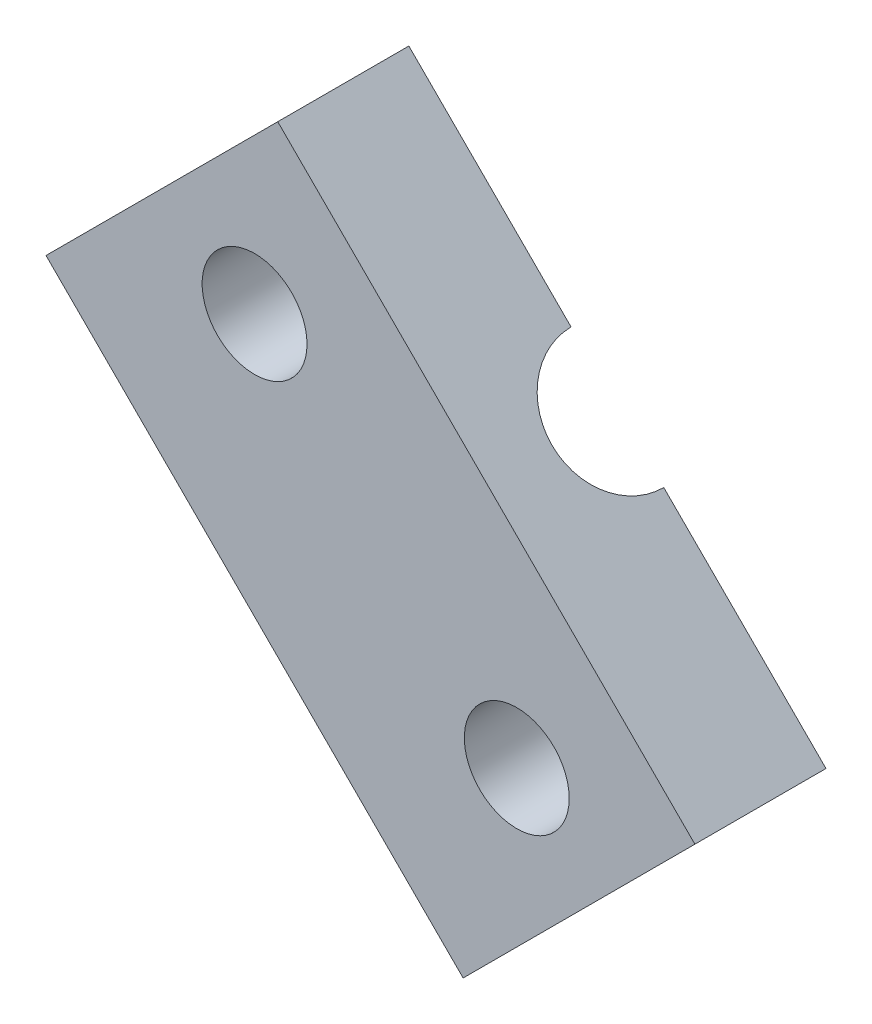
ISO-10303-21;
HEADER;
FILE_DESCRIPTION(('STEP AP214'),'2;1');
FILE_NAME('part.step','',(''),(''),'','','');
FILE_SCHEMA(('AUTOMOTIVE_DESIGN { 1 0 10303 214 1 1 1 1 }'));
ENDSEC;
DATA;
#1=APPLICATION_CONTEXT('core data for automotive mechanical design processes');
#2=APPLICATION_PROTOCOL_DEFINITION('international standard','automotive_design',2000,#1);
#3=PRODUCT_CONTEXT('',#1,'mechanical');
#4=PRODUCT('Part','Part','',(#3));
#5=PRODUCT_RELATED_PRODUCT_CATEGORY('part','',(#4));
#6=PRODUCT_DEFINITION_FORMATION('','',#4);
#7=PRODUCT_DEFINITION_CONTEXT('part definition',#1,'design');
#8=PRODUCT_DEFINITION('design','',#6,#7);
#9=PRODUCT_DEFINITION_SHAPE('','',#8);
#10=(LENGTH_UNIT() NAMED_UNIT(*) SI_UNIT(.MILLI.,.METRE.));
#11=(NAMED_UNIT(*) PLANE_ANGLE_UNIT() SI_UNIT($,.RADIAN.));
#12=(NAMED_UNIT(*) SI_UNIT($,.STERADIAN.) SOLID_ANGLE_UNIT());
#13=UNCERTAINTY_MEASURE_WITH_UNIT(LENGTH_MEASURE(1.E-05),#10,'distance_accuracy_value','');
#14=(GEOMETRIC_REPRESENTATION_CONTEXT(3) GLOBAL_UNCERTAINTY_ASSIGNED_CONTEXT((#13)) GLOBAL_UNIT_ASSIGNED_CONTEXT((#10,
#11,#12)) REPRESENTATION_CONTEXT('',''));
#15=CARTESIAN_POINT('',(0.,0.,0.));
#16=DIRECTION('',(0.,0.,1.));
#17=DIRECTION('',(1.,0.,0.));
#18=AXIS2_PLACEMENT_3D('',#15,#16,#17);
#19=CARTESIAN_POINT('',(7.07106781186549,7.07106781186546,0.));
#20=DIRECTION('',(-0.707106781186549,-0.707106781186546,0.));
#21=DIRECTION('',(0.707106781186546,-0.707106781186549,0.));
#22=AXIS2_PLACEMENT_3D('',#19,#20,#21);
#23=CYLINDRICAL_SURFACE('',#22,2.00000000000002);
#24=CARTESIAN_POINT('',(0.,0.,0.));
#25=DIRECTION('',(0.707106781186549,0.707106781186546,0.));
#26=DIRECTION('',(-0.707106781186546,0.707106781186549,0.));
#27=AXIS2_PLACEMENT_3D('',#24,#25,#26);
#28=CIRCLE('',#27,2.00000000000002);
#29=CARTESIAN_POINT('',(-1.41421356237311,1.41421356237311,0.));
#30=VERTEX_POINT('',#29);
#31=CARTESIAN_POINT('',(1.41421356237311,-1.41421356237311,0.));
#32=VERTEX_POINT('',#31);
#33=EDGE_CURVE('E129',#30,#32,#28,.T.);
#34=ORIENTED_EDGE('',*,*,#33,.F.);
#35=DIRECTION('',(-0.707106781186549,-0.707106781186546,0.));
#36=VECTOR('',#35,1.);
#37=CARTESIAN_POINT('',(5.65685424949238,8.48528137423858,0.));
#38=LINE('',#37,#36);
#39=CARTESIAN_POINT('',(5.65685424949238,8.48528137423858,0.));
#40=VERTEX_POINT('',#39);
#41=EDGE_CURVE('E11',#40,#30,#38,.T.);
#42=ORIENTED_EDGE('',*,*,#41,.F.);
#43=CARTESIAN_POINT('',(7.07106781186549,7.07106781186546,0.));
#44=DIRECTION('',(0.707106781186549,0.707106781186546,0.));
#45=DIRECTION('',(-0.707106781186546,0.707106781186549,0.));
#46=AXIS2_PLACEMENT_3D('',#43,#44,#45);
#47=CIRCLE('',#46,2.00000000000002);
#48=CARTESIAN_POINT('',(8.4852813742386,5.65685424949235,0.));
#49=VERTEX_POINT('',#48);
#50=EDGE_CURVE('E155',#40,#49,#47,.T.);
#51=ORIENTED_EDGE('',*,*,#50,.T.);
#52=DIRECTION('',(-0.707106781186549,-0.707106781186546,0.));
#53=VECTOR('',#52,1.);
#54=CARTESIAN_POINT('',(8.4852813742386,5.65685424949235,0.));
#55=LINE('',#54,#53);
#56=EDGE_CURVE('E62',#49,#32,#55,.T.);
#57=ORIENTED_EDGE('',*,*,#56,.T.);
#58=EDGE_LOOP('',(#34,#42,#51,#57));
#59=FACE_BOUND('',#58,.T.);
#60=ADVANCED_FACE('F45',(#59),#23,.F.);
#61=CARTESIAN_POINT('',(7.07106781186549,7.07106781186546,0.));
#62=DIRECTION('',(0.,0.,-1.));
#63=DIRECTION('',(0.,1.,0.));
#64=AXIS2_PLACEMENT_3D('',#61,#62,#63);
#65=PLANE('',#64);
#66=CARTESIAN_POINT('',(0.,8.00000000000004,0.));
#67=DIRECTION('',(0.,0.,-1.));
#68=DIRECTION('',(0.,1.,0.));
#69=AXIS2_PLACEMENT_3D('',#66,#67,#68);
#70=CIRCLE('',#69,1.6);
#71=CARTESIAN_POINT('',(0.,9.60000000000004,0.));
#72=VERTEX_POINT('',#71);
#73=EDGE_CURVE('E132',#72,#72,#70,.T.);
#74=ORIENTED_EDGE('',*,*,#73,.F.);
#75=EDGE_LOOP('',(#74));
#76=FACE_BOUND('',#75,.T.);
#77=DIRECTION('',(0.707106781186546,-0.707106781186549,0.));
#78=VECTOR('',#77,1.);
#79=CARTESIAN_POINT('',(0.,0.,0.));
#80=LINE('',#79,#78);
#81=CARTESIAN_POINT('',(-6.36396103067891,6.36396103067892,0.));
#82=VERTEX_POINT('',#81);
#83=EDGE_CURVE('E131',#82,#30,#80,.T.);
#84=ORIENTED_EDGE('',*,*,#83,.F.);
#85=DIRECTION('',(-0.707106781186549,-0.707106781186546,0.));
#86=VECTOR('',#85,1.);
#87=CARTESIAN_POINT('',(0.707106781186583,13.4350288425444,0.));
#88=LINE('',#87,#86);
#89=CARTESIAN_POINT('',(0.707106781186583,13.4350288425444,0.));
#90=VERTEX_POINT('',#89);
#91=EDGE_CURVE('E54',#90,#82,#88,.T.);
#92=ORIENTED_EDGE('',*,*,#91,.F.);
#93=DIRECTION('',(0.707106781186546,-0.707106781186549,0.));
#94=VECTOR('',#93,1.);
#95=CARTESIAN_POINT('',(7.07106781186549,7.07106781186546,0.));
#96=LINE('',#95,#94);
#97=EDGE_CURVE('E126',#90,#40,#96,.T.);
#98=ORIENTED_EDGE('',*,*,#97,.T.);
#99=ORIENTED_EDGE('',*,*,#41,.T.);
#100=EDGE_LOOP('',(#84,#92,#98,#99));
#101=FACE_BOUND('',#100,.T.);
#102=ADVANCED_FACE('F152',(#76,#101),#65,.T.);
#103=CARTESIAN_POINT('',(0.707106781186583,13.4350288425444,0.));
#104=DIRECTION('',(0.707106781186546,-0.707106781186549,0.));
#105=DIRECTION('',(0.707106781186549,0.707106781186546,0.));
#106=AXIS2_PLACEMENT_3D('',#103,#104,#105);
#107=PLANE('',#106);
#108=DIRECTION('',(0.,0.,1.));
#109=VECTOR('',#108,1.);
#110=CARTESIAN_POINT('',(-6.36396103067891,6.36396103067892,0.));
#111=LINE('',#110,#109);
#112=CARTESIAN_POINT('',(-6.3639610306789,6.36396103067892,4.00000000000001));
#113=VERTEX_POINT('',#112);
#114=EDGE_CURVE('E135',#82,#113,#111,.T.);
#115=ORIENTED_EDGE('',*,*,#114,.T.);
#116=DIRECTION('',(-0.707106781186549,-0.707106781186546,0.));
#117=VECTOR('',#116,1.);
#118=CARTESIAN_POINT('',(0.707106781186584,13.4350288425444,4.00000000000001));
#119=LINE('',#118,#117);
#120=CARTESIAN_POINT('',(0.707106781186584,13.4350288425444,4.00000000000001));
#121=VERTEX_POINT('',#120);
#122=EDGE_CURVE('E120',#121,#113,#119,.T.);
#123=ORIENTED_EDGE('',*,*,#122,.F.);
#124=DIRECTION('',(0.,0.,1.));
#125=VECTOR('',#124,1.);
#126=CARTESIAN_POINT('',(0.707106781186583,13.4350288425444,0.));
#127=LINE('',#126,#125);
#128=EDGE_CURVE('E108',#90,#121,#127,.T.);
#129=ORIENTED_EDGE('',*,*,#128,.F.);
#130=ORIENTED_EDGE('',*,*,#91,.T.);
#131=EDGE_LOOP('',(#115,#123,#129,#130));
#132=FACE_BOUND('',#131,.T.);
#133=ADVANCED_FACE('F146',(#132),#107,.F.);
#134=CARTESIAN_POINT('',(7.07106781186549,7.07106781186546,4.00000000000001));
#135=DIRECTION('',(0.,0.,-1.));
#136=DIRECTION('',(0.,1.,0.));
#137=AXIS2_PLACEMENT_3D('',#134,#135,#136);
#138=PLANE('',#137);
#139=CARTESIAN_POINT('',(0.,8.00000000000004,4.00000000000001));
#140=DIRECTION('',(0.,0.,1.));
#141=DIRECTION('',(1.,0.,0.));
#142=AXIS2_PLACEMENT_3D('',#139,#140,#141);
#143=CIRCLE('',#142,1.6);
#144=CARTESIAN_POINT('',(1.60000000000007,8.00000000000004,4.00000000000001));
#145=VERTEX_POINT('',#144);
#146=EDGE_CURVE('E163',#145,#145,#143,.T.);
#147=ORIENTED_EDGE('',*,*,#146,.F.);
#148=EDGE_LOOP('',(#147));
#149=FACE_BOUND('',#148,.T.);
#150=CARTESIAN_POINT('',(8.00000000000002,0.,4.00000000000001));
#151=DIRECTION('',(0.,0.,1.));
#152=DIRECTION('',(1.,0.,0.));
#153=AXIS2_PLACEMENT_3D('',#150,#151,#152);
#154=CIRCLE('',#153,1.6);
#155=CARTESIAN_POINT('',(9.60000000000002,0.,4.00000000000001));
#156=VERTEX_POINT('',#155);
#157=EDGE_CURVE('E160',#156,#156,#154,.T.);
#158=ORIENTED_EDGE('',*,*,#157,.F.);
#159=EDGE_LOOP('',(#158));
#160=FACE_BOUND('',#159,.T.);
#161=DIRECTION('',(0.707106781186546,-0.707106781186549,0.));
#162=VECTOR('',#161,1.);
#163=CARTESIAN_POINT('',(0.,0.,4.00000000000001));
#164=LINE('',#163,#162);
#165=CARTESIAN_POINT('',(6.36396103067894,-6.36396103067896,4.));
#166=VERTEX_POINT('',#165);
#167=EDGE_CURVE('E117',#113,#166,#164,.T.);
#168=ORIENTED_EDGE('',*,*,#167,.T.);
#169=DIRECTION('',(-0.707106781186549,-0.707106781186546,0.));
#170=VECTOR('',#169,1.);
#171=CARTESIAN_POINT('',(13.4350288425444,0.707106781186508,4.));
#172=LINE('',#171,#170);
#173=CARTESIAN_POINT('',(13.4350288425444,0.707106781186508,4.));
#174=VERTEX_POINT('',#173);
#175=EDGE_CURVE('E114',#174,#166,#172,.T.);
#176=ORIENTED_EDGE('',*,*,#175,.F.);
#177=DIRECTION('',(0.707106781186546,-0.707106781186549,0.));
#178=VECTOR('',#177,1.);
#179=CARTESIAN_POINT('',(7.07106781186549,7.07106781186546,4.00000000000001));
#180=LINE('',#179,#178);
#181=EDGE_CURVE('E100',#121,#174,#180,.T.);
#182=ORIENTED_EDGE('',*,*,#181,.F.);
#183=ORIENTED_EDGE('',*,*,#122,.T.);
#184=EDGE_LOOP('',(#168,#176,#182,#183));
#185=FACE_BOUND('',#184,.T.);
#186=ADVANCED_FACE('F115',(#149,#160,#185),#138,.F.);
#187=CARTESIAN_POINT('',(13.4350288425444,0.707106781186505,0.));
#188=DIRECTION('',(0.707106781186546,-0.707106781186549,0.));
#189=DIRECTION('',(0.707106781186549,0.707106781186546,0.));
#190=AXIS2_PLACEMENT_3D('',#187,#188,#189);
#191=PLANE('',#190);
#192=DIRECTION('',(0.,0.,1.));
#193=VECTOR('',#192,1.);
#194=CARTESIAN_POINT('',(6.36396103067894,-6.36396103067896,0.));
#195=LINE('',#194,#193);
#196=CARTESIAN_POINT('',(6.36396103067894,-6.36396103067896,0.));
#197=VERTEX_POINT('',#196);
#198=EDGE_CURVE('E139',#197,#166,#195,.T.);
#199=ORIENTED_EDGE('',*,*,#198,.F.);
#200=DIRECTION('',(-0.707106781186549,-0.707106781186546,0.));
#201=VECTOR('',#200,1.);
#202=CARTESIAN_POINT('',(13.4350288425444,0.707106781186507,0.));
#203=LINE('',#202,#201);
#204=CARTESIAN_POINT('',(13.4350288425444,0.707106781186507,0.));
#205=VERTEX_POINT('',#204);
#206=EDGE_CURVE('E81',#205,#197,#203,.T.);
#207=ORIENTED_EDGE('',*,*,#206,.F.);
#208=DIRECTION('',(0.,0.,1.));
#209=VECTOR('',#208,1.);
#210=CARTESIAN_POINT('',(13.4350288425444,0.707106781186505,0.));
#211=LINE('',#210,#209);
#212=EDGE_CURVE('E105',#205,#174,#211,.T.);
#213=ORIENTED_EDGE('',*,*,#212,.T.);
#214=ORIENTED_EDGE('',*,*,#175,.T.);
#215=EDGE_LOOP('',(#199,#207,#213,#214));
#216=FACE_BOUND('',#215,.T.);
#217=ADVANCED_FACE('F122',(#216),#191,.T.);
#218=CARTESIAN_POINT('',(8.00000000000002,0.,0.));
#219=DIRECTION('',(0.,0.,-1.));
#220=DIRECTION('',(0.,1.,0.));
#221=AXIS2_PLACEMENT_3D('',#218,#219,#220);
#222=CIRCLE('',#221,1.6);
#223=CARTESIAN_POINT('',(8.00000000000002,1.60000000000002,0.));
#224=VERTEX_POINT('',#223);
#225=EDGE_CURVE('E48',#224,#224,#222,.T.);
#226=ORIENTED_EDGE('',*,*,#225,.F.);
#227=EDGE_LOOP('',(#226));
#228=FACE_BOUND('',#227,.T.);
#229=EDGE_CURVE('E136',#32,#197,#80,.T.);
#230=ORIENTED_EDGE('',*,*,#229,.F.);
#231=ORIENTED_EDGE('',*,*,#56,.F.);
#232=EDGE_CURVE('E123',#49,#205,#96,.T.);
#233=ORIENTED_EDGE('',*,*,#232,.T.);
#234=ORIENTED_EDGE('',*,*,#206,.T.);
#235=EDGE_LOOP('',(#230,#231,#233,#234));
#236=FACE_BOUND('',#235,.T.);
#237=ADVANCED_FACE('F154',(#228,#236),#65,.T.);
#238=CARTESIAN_POINT('',(7.07106781186549,7.07106781186546,0.));
#239=DIRECTION('',(0.707106781186549,0.707106781186546,0.));
#240=DIRECTION('',(-0.707106781186546,0.707106781186549,0.));
#241=AXIS2_PLACEMENT_3D('',#238,#239,#240);
#242=PLANE('',#241);
#243=ORIENTED_EDGE('',*,*,#50,.F.);
#244=ORIENTED_EDGE('',*,*,#97,.F.);
#245=ORIENTED_EDGE('',*,*,#128,.T.);
#246=ORIENTED_EDGE('',*,*,#181,.T.);
#247=ORIENTED_EDGE('',*,*,#212,.F.);
#248=ORIENTED_EDGE('',*,*,#232,.F.);
#249=EDGE_LOOP('',(#243,#244,#245,#246,#247,#248));
#250=FACE_BOUND('',#249,.T.);
#251=ADVANCED_FACE('F102',(#250),#242,.T.);
#252=CARTESIAN_POINT('',(0.,0.,0.));
#253=DIRECTION('',(0.707106781186549,0.707106781186546,0.));
#254=DIRECTION('',(-0.707106781186546,0.707106781186549,0.));
#255=AXIS2_PLACEMENT_3D('',#252,#253,#254);
#256=PLANE('',#255);
#257=ORIENTED_EDGE('',*,*,#33,.T.);
#258=ORIENTED_EDGE('',*,*,#229,.T.);
#259=ORIENTED_EDGE('',*,*,#198,.T.);
#260=ORIENTED_EDGE('',*,*,#167,.F.);
#261=ORIENTED_EDGE('',*,*,#114,.F.);
#262=ORIENTED_EDGE('',*,*,#83,.T.);
#263=EDGE_LOOP('',(#257,#258,#259,#260,#261,#262));
#264=FACE_BOUND('',#263,.T.);
#265=ADVANCED_FACE('F151',(#264),#256,.F.);
#266=CARTESIAN_POINT('',(8.00000000000002,0.,-5.99999999999999));
#267=DIRECTION('',(0.,0.,1.));
#268=DIRECTION('',(1.,0.,0.));
#269=AXIS2_PLACEMENT_3D('',#266,#267,#268);
#270=CYLINDRICAL_SURFACE('',#269,1.6);
#271=ORIENTED_EDGE('',*,*,#225,.T.);
#272=EDGE_LOOP('',(#271));
#273=FACE_BOUND('',#272,.T.);
#274=ORIENTED_EDGE('',*,*,#157,.T.);
#275=EDGE_LOOP('',(#274));
#276=FACE_BOUND('',#275,.T.);
#277=ADVANCED_FACE('F170',(#273,#276),#270,.F.);
#278=CARTESIAN_POINT('',(0.,8.00000000000004,-5.99999999999999));
#279=DIRECTION('',(0.,0.,1.));
#280=DIRECTION('',(1.,0.,0.));
#281=AXIS2_PLACEMENT_3D('',#278,#279,#280);
#282=CYLINDRICAL_SURFACE('',#281,1.6);
#283=ORIENTED_EDGE('',*,*,#73,.T.);
#284=EDGE_LOOP('',(#283));
#285=FACE_BOUND('',#284,.T.);
#286=ORIENTED_EDGE('',*,*,#146,.T.);
#287=EDGE_LOOP('',(#286));
#288=FACE_BOUND('',#287,.T.);
#289=ADVANCED_FACE('F239',(#285,#288),#282,.F.);
#290=CLOSED_SHELL('',(#60,#102,#133,#186,#217,#237,#251,#265,#277,#289));
#291=MANIFOLD_SOLID_BREP('B2',#290);
#292=ADVANCED_BREP_SHAPE_REPRESENTATION('',(#18,#291),#14);
#293=SHAPE_DEFINITION_REPRESENTATION(#9,#292);
ENDSEC;
END-ISO-10303-21;
